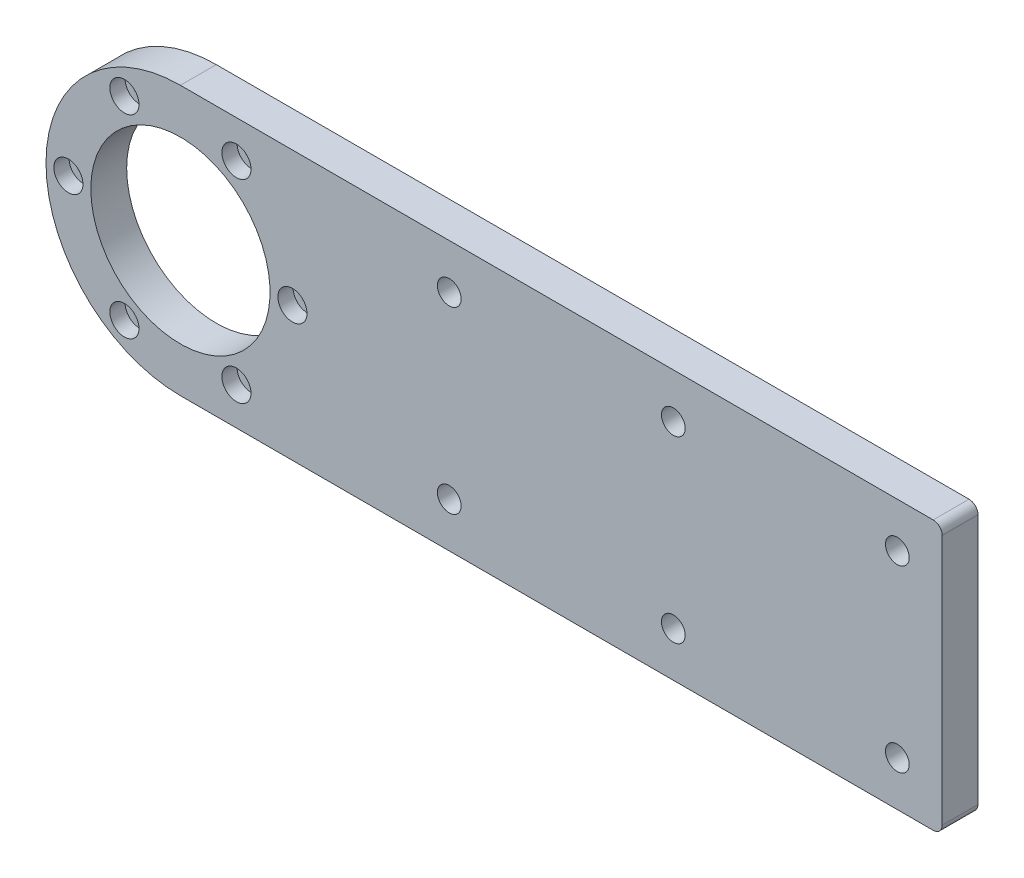
ISO-10303-21;
HEADER;
FILE_DESCRIPTION(('STEP AP214'),'2;1');
FILE_NAME('part.step','',(''),(''),'','','');
FILE_SCHEMA(('AUTOMOTIVE_DESIGN { 1 0 10303 214 1 1 1 1 }'));
ENDSEC;
DATA;
#1=APPLICATION_CONTEXT('core data for automotive mechanical design processes');
#2=APPLICATION_PROTOCOL_DEFINITION('international standard','automotive_design',2000,#1);
#3=PRODUCT_CONTEXT('',#1,'mechanical');
#4=PRODUCT('Part','Part','',(#3));
#5=PRODUCT_RELATED_PRODUCT_CATEGORY('part','',(#4));
#6=PRODUCT_DEFINITION_FORMATION('','',#4);
#7=PRODUCT_DEFINITION_CONTEXT('part definition',#1,'design');
#8=PRODUCT_DEFINITION('design','',#6,#7);
#9=PRODUCT_DEFINITION_SHAPE('','',#8);
#10=(LENGTH_UNIT() NAMED_UNIT(*) SI_UNIT(.MILLI.,.METRE.));
#11=(NAMED_UNIT(*) PLANE_ANGLE_UNIT() SI_UNIT($,.RADIAN.));
#12=(NAMED_UNIT(*) SI_UNIT($,.STERADIAN.) SOLID_ANGLE_UNIT());
#13=UNCERTAINTY_MEASURE_WITH_UNIT(LENGTH_MEASURE(1.E-05),#10,'distance_accuracy_value','');
#14=(GEOMETRIC_REPRESENTATION_CONTEXT(3) GLOBAL_UNCERTAINTY_ASSIGNED_CONTEXT((#13)) GLOBAL_UNIT_ASSIGNED_CONTEXT((#10,
#11,#12)) REPRESENTATION_CONTEXT('',''));
#15=CARTESIAN_POINT('',(0.,0.,0.));
#16=DIRECTION('',(0.,0.,1.));
#17=DIRECTION('',(1.,0.,0.));
#18=AXIS2_PLACEMENT_3D('',#15,#16,#17);
#19=CARTESIAN_POINT('',(0.,0.,0.));
#20=DIRECTION('',(0.,0.,1.));
#21=DIRECTION('',(-1.,0.,0.));
#22=AXIS2_PLACEMENT_3D('',#19,#20,#21);
#23=CYLINDRICAL_SURFACE('',#22,30.);
#24=CARTESIAN_POINT('',(0.,0.,0.));
#25=DIRECTION('',(0.,0.,1.));
#26=DIRECTION('',(1.,0.,0.));
#27=AXIS2_PLACEMENT_3D('',#24,#25,#26);
#28=CIRCLE('',#27,30.);
#29=CARTESIAN_POINT('',(0.,30.,0.));
#30=VERTEX_POINT('',#29);
#31=CARTESIAN_POINT('',(0.,-30.,0.));
#32=VERTEX_POINT('',#31);
#33=EDGE_CURVE('E316',#30,#32,#28,.T.);
#34=ORIENTED_EDGE('',*,*,#33,.T.);
#35=DIRECTION('',(0.,0.,1.));
#36=VECTOR('',#35,1.);
#37=CARTESIAN_POINT('',(0.,-30.,0.));
#38=LINE('',#37,#36);
#39=CARTESIAN_POINT('',(0.,-30.,8.));
#40=VERTEX_POINT('',#39);
#41=EDGE_CURVE('E276',#32,#40,#38,.T.);
#42=ORIENTED_EDGE('',*,*,#41,.T.);
#43=CARTESIAN_POINT('',(0.,0.,8.));
#44=DIRECTION('',(0.,0.,1.));
#45=DIRECTION('',(1.,0.,0.));
#46=AXIS2_PLACEMENT_3D('',#43,#44,#45);
#47=CIRCLE('',#46,30.);
#48=CARTESIAN_POINT('',(0.,30.,8.));
#49=VERTEX_POINT('',#48);
#50=EDGE_CURVE('E289',#49,#40,#47,.T.);
#51=ORIENTED_EDGE('',*,*,#50,.F.);
#52=DIRECTION('',(0.,0.,1.));
#53=VECTOR('',#52,1.);
#54=CARTESIAN_POINT('',(0.,30.,0.));
#55=LINE('',#54,#53);
#56=EDGE_CURVE('E366',#30,#49,#55,.T.);
#57=ORIENTED_EDGE('',*,*,#56,.F.);
#58=EDGE_LOOP('',(#34,#42,#51,#57));
#59=FACE_BOUND('',#58,.T.);
#60=ADVANCED_FACE('F17',(#59),#23,.T.);
#61=CARTESIAN_POINT('',(0.,0.,8.));
#62=DIRECTION('',(0.,0.,-1.));
#63=DIRECTION('',(1.,0.,0.));
#64=AXIS2_PLACEMENT_3D('',#61,#62,#63);
#65=CYLINDRICAL_SURFACE('',#64,20.);
#66=CARTESIAN_POINT('',(0.,0.,8.));
#67=DIRECTION('',(0.,0.,-1.));
#68=DIRECTION('',(1.,0.,0.));
#69=AXIS2_PLACEMENT_3D('',#66,#67,#68);
#70=CIRCLE('',#69,20.);
#71=CARTESIAN_POINT('',(-20.,0.,8.));
#72=VERTEX_POINT('',#71);
#73=EDGE_CURVE('E356',#72,#72,#70,.T.);
#74=ORIENTED_EDGE('',*,*,#73,.F.);
#75=DIRECTION('',(0.,0.,-1.));
#76=VECTOR('',#75,1.);
#77=CARTESIAN_POINT('',(-20.,0.,8.));
#78=LINE('',#77,#76);
#79=CARTESIAN_POINT('',(-20.,0.,0.));
#80=VERTEX_POINT('',#79);
#81=EDGE_CURVE('E11',#72,#80,#78,.T.);
#82=ORIENTED_EDGE('',*,*,#81,.T.);
#83=CARTESIAN_POINT('',(0.,0.,0.));
#84=DIRECTION('',(0.,0.,1.));
#85=DIRECTION('',(1.,0.,0.));
#86=AXIS2_PLACEMENT_3D('',#83,#84,#85);
#87=CIRCLE('',#86,20.);
#88=EDGE_CURVE('E311',#80,#80,#87,.T.);
#89=ORIENTED_EDGE('',*,*,#88,.F.);
#90=ORIENTED_EDGE('',*,*,#81,.F.);
#91=EDGE_LOOP('',(#74,#82,#89,#90));
#92=FACE_BOUND('',#91,.T.);
#93=ADVANCED_FACE('F549',(#92),#65,.F.);
#94=CARTESIAN_POINT('',(-25.,0.,-436.144120753613));
#95=DIRECTION('',(0.,0.,1.));
#96=DIRECTION('',(1.,0.,0.));
#97=AXIS2_PLACEMENT_3D('',#94,#95,#96);
#98=CYLINDRICAL_SURFACE('',#97,1.6);
#99=CARTESIAN_POINT('',(-25.,0.,4.6));
#100=DIRECTION('',(0.,0.,1.));
#101=DIRECTION('',(1.,0.,0.));
#102=AXIS2_PLACEMENT_3D('',#99,#100,#101);
#103=CIRCLE('',#102,1.6);
#104=CARTESIAN_POINT('',(-26.6,0.,4.6));
#105=VERTEX_POINT('',#104);
#106=EDGE_CURVE('E414',#105,#105,#103,.T.);
#107=ORIENTED_EDGE('',*,*,#106,.T.);
#108=DIRECTION('',(0.,0.,-1.));
#109=VECTOR('',#108,1.);
#110=CARTESIAN_POINT('',(-26.6,0.,-436.144120753613));
#111=LINE('',#110,#109);
#112=CARTESIAN_POINT('',(-26.6,0.,0.));
#113=VERTEX_POINT('',#112);
#114=EDGE_CURVE('E21',#105,#113,#111,.T.);
#115=ORIENTED_EDGE('',*,*,#114,.T.);
#116=CARTESIAN_POINT('',(-25.,0.,0.));
#117=DIRECTION('',(0.,0.,1.));
#118=DIRECTION('',(1.,0.,0.));
#119=AXIS2_PLACEMENT_3D('',#116,#117,#118);
#120=CIRCLE('',#119,1.6);
#121=EDGE_CURVE('E315',#113,#113,#120,.T.);
#122=ORIENTED_EDGE('',*,*,#121,.F.);
#123=ORIENTED_EDGE('',*,*,#114,.F.);
#124=EDGE_LOOP('',(#107,#115,#122,#123));
#125=FACE_BOUND('',#124,.T.);
#126=ADVANCED_FACE('F19',(#125),#98,.F.);
#127=CARTESIAN_POINT('',(-25.,0.,6.3));
#128=DIRECTION('',(0.,0.,1.));
#129=DIRECTION('',(1.,0.,0.));
#130=AXIS2_PLACEMENT_3D('',#127,#128,#129);
#131=CYLINDRICAL_SURFACE('',#130,3.25);
#132=CARTESIAN_POINT('',(-25.,0.,8.));
#133=DIRECTION('',(0.,0.,-1.));
#134=DIRECTION('',(1.,0.,0.));
#135=AXIS2_PLACEMENT_3D('',#132,#133,#134);
#136=CIRCLE('',#135,3.25);
#137=CARTESIAN_POINT('',(-28.25,0.,8.));
#138=VERTEX_POINT('',#137);
#139=EDGE_CURVE('E349',#138,#138,#136,.T.);
#140=ORIENTED_EDGE('',*,*,#139,.F.);
#141=DIRECTION('',(0.,0.,-1.));
#142=VECTOR('',#141,1.);
#143=CARTESIAN_POINT('',(-28.25,0.,6.3));
#144=LINE('',#143,#142);
#145=CARTESIAN_POINT('',(-28.25,0.,4.6));
#146=VERTEX_POINT('',#145);
#147=EDGE_CURVE('E47',#138,#146,#144,.T.);
#148=ORIENTED_EDGE('',*,*,#147,.T.);
#149=CARTESIAN_POINT('',(-25.,0.,4.6));
#150=DIRECTION('',(0.,0.,1.));
#151=DIRECTION('',(1.,0.,0.));
#152=AXIS2_PLACEMENT_3D('',#149,#150,#151);
#153=CIRCLE('',#152,3.25);
#154=EDGE_CURVE('E370',#146,#146,#153,.T.);
#155=ORIENTED_EDGE('',*,*,#154,.F.);
#156=ORIENTED_EDGE('',*,*,#147,.F.);
#157=EDGE_LOOP('',(#140,#148,#155,#156));
#158=FACE_BOUND('',#157,.T.);
#159=ADVANCED_FACE('F565',(#158),#131,.F.);
#160=CARTESIAN_POINT('',(-25.,0.,4.6));
#161=DIRECTION('',(0.,0.,1.));
#162=DIRECTION('',(1.,0.,0.));
#163=AXIS2_PLACEMENT_3D('',#160,#161,#162);
#164=PLANE('',#163);
#165=ORIENTED_EDGE('',*,*,#106,.F.);
#166=EDGE_LOOP('',(#165));
#167=FACE_BOUND('',#166,.T.);
#168=ORIENTED_EDGE('',*,*,#154,.T.);
#169=EDGE_LOOP('',(#168));
#170=FACE_BOUND('',#169,.T.);
#171=ADVANCED_FACE('F561',(#167,#170),#164,.T.);
#172=CARTESIAN_POINT('',(-12.5,-21.650635094611,-436.144120753613));
#173=DIRECTION('',(0.,0.,1.));
#174=DIRECTION('',(1.,0.,0.));
#175=AXIS2_PLACEMENT_3D('',#172,#173,#174);
#176=CYLINDRICAL_SURFACE('',#175,1.6);
#177=CARTESIAN_POINT('',(-12.5,-21.650635094611,4.6));
#178=DIRECTION('',(0.,0.,1.));
#179=DIRECTION('',(1.,0.,0.));
#180=AXIS2_PLACEMENT_3D('',#177,#178,#179);
#181=CIRCLE('',#180,1.6);
#182=CARTESIAN_POINT('',(-14.1,-21.650635094611,4.6));
#183=VERTEX_POINT('',#182);
#184=EDGE_CURVE('E305',#183,#183,#181,.T.);
#185=ORIENTED_EDGE('',*,*,#184,.T.);
#186=DIRECTION('',(0.,0.,-1.));
#187=VECTOR('',#186,1.);
#188=CARTESIAN_POINT('',(-14.1,-21.650635094611,-436.144120753613));
#189=LINE('',#188,#187);
#190=CARTESIAN_POINT('',(-14.1,-21.650635094611,0.));
#191=VERTEX_POINT('',#190);
#192=EDGE_CURVE('E367',#183,#191,#189,.T.);
#193=ORIENTED_EDGE('',*,*,#192,.T.);
#194=CARTESIAN_POINT('',(-12.5,-21.650635094611,0.));
#195=DIRECTION('',(0.,0.,1.));
#196=DIRECTION('',(1.,0.,0.));
#197=AXIS2_PLACEMENT_3D('',#194,#195,#196);
#198=CIRCLE('',#197,1.6);
#199=EDGE_CURVE('E381',#191,#191,#198,.T.);
#200=ORIENTED_EDGE('',*,*,#199,.F.);
#201=ORIENTED_EDGE('',*,*,#192,.F.);
#202=EDGE_LOOP('',(#185,#193,#200,#201));
#203=FACE_BOUND('',#202,.T.);
#204=ADVANCED_FACE('F564',(#203),#176,.F.);
#205=CARTESIAN_POINT('',(-12.5,-21.650635094611,6.3));
#206=DIRECTION('',(0.,0.,1.));
#207=DIRECTION('',(1.,0.,0.));
#208=AXIS2_PLACEMENT_3D('',#205,#206,#207);
#209=CYLINDRICAL_SURFACE('',#208,3.25);
#210=CARTESIAN_POINT('',(-12.5,-21.650635094611,8.));
#211=DIRECTION('',(0.,0.,-1.));
#212=DIRECTION('',(1.,0.,0.));
#213=AXIS2_PLACEMENT_3D('',#210,#211,#212);
#214=CIRCLE('',#213,3.25);
#215=CARTESIAN_POINT('',(-15.75,-21.650635094611,8.));
#216=VERTEX_POINT('',#215);
#217=EDGE_CURVE('E345',#216,#216,#214,.T.);
#218=ORIENTED_EDGE('',*,*,#217,.F.);
#219=DIRECTION('',(0.,0.,-1.));
#220=VECTOR('',#219,1.);
#221=CARTESIAN_POINT('',(-15.75,-21.650635094611,6.3));
#222=LINE('',#221,#220);
#223=CARTESIAN_POINT('',(-15.75,-21.650635094611,4.6));
#224=VERTEX_POINT('',#223);
#225=EDGE_CURVE('E309',#216,#224,#222,.T.);
#226=ORIENTED_EDGE('',*,*,#225,.T.);
#227=CARTESIAN_POINT('',(-12.5,-21.650635094611,4.6));
#228=DIRECTION('',(0.,0.,1.));
#229=DIRECTION('',(1.,0.,0.));
#230=AXIS2_PLACEMENT_3D('',#227,#228,#229);
#231=CIRCLE('',#230,3.25);
#232=EDGE_CURVE('E310',#224,#224,#231,.T.);
#233=ORIENTED_EDGE('',*,*,#232,.F.);
#234=ORIENTED_EDGE('',*,*,#225,.F.);
#235=EDGE_LOOP('',(#218,#226,#233,#234));
#236=FACE_BOUND('',#235,.T.);
#237=ADVANCED_FACE('F570',(#236),#209,.F.);
#238=CARTESIAN_POINT('',(-12.5,-21.650635094611,4.6));
#239=DIRECTION('',(0.,0.,1.));
#240=DIRECTION('',(1.,0.,0.));
#241=AXIS2_PLACEMENT_3D('',#238,#239,#240);
#242=PLANE('',#241);
#243=ORIENTED_EDGE('',*,*,#184,.F.);
#244=EDGE_LOOP('',(#243));
#245=FACE_BOUND('',#244,.T.);
#246=ORIENTED_EDGE('',*,*,#232,.T.);
#247=EDGE_LOOP('',(#246));
#248=FACE_BOUND('',#247,.T.);
#249=ADVANCED_FACE('F567',(#245,#248),#242,.T.);
#250=CARTESIAN_POINT('',(12.5,-21.650635094611,-436.144120753613));
#251=DIRECTION('',(0.,0.,1.));
#252=DIRECTION('',(1.,0.,0.));
#253=AXIS2_PLACEMENT_3D('',#250,#251,#252);
#254=CYLINDRICAL_SURFACE('',#253,1.6);
#255=CARTESIAN_POINT('',(12.5,-21.650635094611,4.6));
#256=DIRECTION('',(0.,0.,1.));
#257=DIRECTION('',(1.,0.,0.));
#258=AXIS2_PLACEMENT_3D('',#255,#256,#257);
#259=CIRCLE('',#258,1.6);
#260=CARTESIAN_POINT('',(10.9,-21.650635094611,4.6));
#261=VERTEX_POINT('',#260);
#262=EDGE_CURVE('E327',#261,#261,#259,.T.);
#263=ORIENTED_EDGE('',*,*,#262,.T.);
#264=DIRECTION('',(0.,0.,-1.));
#265=VECTOR('',#264,1.);
#266=CARTESIAN_POINT('',(10.9,-21.650635094611,-436.144120753613));
#267=LINE('',#266,#265);
#268=CARTESIAN_POINT('',(10.9,-21.650635094611,0.));
#269=VERTEX_POINT('',#268);
#270=EDGE_CURVE('E340',#261,#269,#267,.T.);
#271=ORIENTED_EDGE('',*,*,#270,.T.);
#272=CARTESIAN_POINT('',(12.5,-21.650635094611,0.));
#273=DIRECTION('',(0.,0.,1.));
#274=DIRECTION('',(1.,0.,0.));
#275=AXIS2_PLACEMENT_3D('',#272,#273,#274);
#276=CIRCLE('',#275,1.6);
#277=EDGE_CURVE('E391',#269,#269,#276,.T.);
#278=ORIENTED_EDGE('',*,*,#277,.F.);
#279=ORIENTED_EDGE('',*,*,#270,.F.);
#280=EDGE_LOOP('',(#263,#271,#278,#279));
#281=FACE_BOUND('',#280,.T.);
#282=ADVANCED_FACE('F559',(#281),#254,.F.);
#283=CARTESIAN_POINT('',(12.5,-21.650635094611,6.3));
#284=DIRECTION('',(0.,0.,1.));
#285=DIRECTION('',(1.,0.,0.));
#286=AXIS2_PLACEMENT_3D('',#283,#284,#285);
#287=CYLINDRICAL_SURFACE('',#286,3.25);
#288=CARTESIAN_POINT('',(12.5,-21.650635094611,8.));
#289=DIRECTION('',(0.,0.,-1.));
#290=DIRECTION('',(1.,0.,0.));
#291=AXIS2_PLACEMENT_3D('',#288,#289,#290);
#292=CIRCLE('',#291,3.25);
#293=CARTESIAN_POINT('',(9.25,-21.650635094611,8.));
#294=VERTEX_POINT('',#293);
#295=EDGE_CURVE('E344',#294,#294,#292,.T.);
#296=ORIENTED_EDGE('',*,*,#295,.F.);
#297=DIRECTION('',(0.,0.,-1.));
#298=VECTOR('',#297,1.);
#299=CARTESIAN_POINT('',(9.25,-21.650635094611,6.3));
#300=LINE('',#299,#298);
#301=CARTESIAN_POINT('',(9.25,-21.650635094611,4.6));
#302=VERTEX_POINT('',#301);
#303=EDGE_CURVE('E337',#294,#302,#300,.T.);
#304=ORIENTED_EDGE('',*,*,#303,.T.);
#305=CARTESIAN_POINT('',(12.5,-21.650635094611,4.6));
#306=DIRECTION('',(0.,0.,1.));
#307=DIRECTION('',(1.,0.,0.));
#308=AXIS2_PLACEMENT_3D('',#305,#306,#307);
#309=CIRCLE('',#308,3.25);
#310=EDGE_CURVE('E323',#302,#302,#309,.T.);
#311=ORIENTED_EDGE('',*,*,#310,.F.);
#312=ORIENTED_EDGE('',*,*,#303,.F.);
#313=EDGE_LOOP('',(#296,#304,#311,#312));
#314=FACE_BOUND('',#313,.T.);
#315=ADVANCED_FACE('F1066',(#314),#287,.F.);
#316=CARTESIAN_POINT('',(12.5,-21.650635094611,4.6));
#317=DIRECTION('',(0.,0.,1.));
#318=DIRECTION('',(1.,0.,0.));
#319=AXIS2_PLACEMENT_3D('',#316,#317,#318);
#320=PLANE('',#319);
#321=ORIENTED_EDGE('',*,*,#262,.F.);
#322=EDGE_LOOP('',(#321));
#323=FACE_BOUND('',#322,.T.);
#324=ORIENTED_EDGE('',*,*,#310,.T.);
#325=EDGE_LOOP('',(#324));
#326=FACE_BOUND('',#325,.T.);
#327=ADVANCED_FACE('F1056',(#323,#326),#320,.T.);
#328=CARTESIAN_POINT('',(25.,0.,-436.144120753613));
#329=DIRECTION('',(0.,0.,1.));
#330=DIRECTION('',(1.,0.,0.));
#331=AXIS2_PLACEMENT_3D('',#328,#329,#330);
#332=CYLINDRICAL_SURFACE('',#331,1.6);
#333=CARTESIAN_POINT('',(25.,0.,4.6));
#334=DIRECTION('',(0.,0.,1.));
#335=DIRECTION('',(1.,0.,0.));
#336=AXIS2_PLACEMENT_3D('',#333,#334,#335);
#337=CIRCLE('',#336,1.6);
#338=CARTESIAN_POINT('',(23.4,0.,4.6));
#339=VERTEX_POINT('',#338);
#340=EDGE_CURVE('E464',#339,#339,#337,.T.);
#341=ORIENTED_EDGE('',*,*,#340,.T.);
#342=DIRECTION('',(0.,0.,-1.));
#343=VECTOR('',#342,1.);
#344=CARTESIAN_POINT('',(23.4,0.,-436.144120753613));
#345=LINE('',#344,#343);
#346=CARTESIAN_POINT('',(23.4,0.,0.));
#347=VERTEX_POINT('',#346);
#348=EDGE_CURVE('E328',#339,#347,#345,.T.);
#349=ORIENTED_EDGE('',*,*,#348,.T.);
#350=CARTESIAN_POINT('',(25.,0.,0.));
#351=DIRECTION('',(0.,0.,1.));
#352=DIRECTION('',(1.,0.,0.));
#353=AXIS2_PLACEMENT_3D('',#350,#351,#352);
#354=CIRCLE('',#353,1.6);
#355=EDGE_CURVE('E411',#347,#347,#354,.T.);
#356=ORIENTED_EDGE('',*,*,#355,.F.);
#357=ORIENTED_EDGE('',*,*,#348,.F.);
#358=EDGE_LOOP('',(#341,#349,#356,#357));
#359=FACE_BOUND('',#358,.T.);
#360=ADVANCED_FACE('F1046',(#359),#332,.F.);
#361=CARTESIAN_POINT('',(25.,0.,6.3));
#362=DIRECTION('',(0.,0.,1.));
#363=DIRECTION('',(1.,0.,0.));
#364=AXIS2_PLACEMENT_3D('',#361,#362,#363);
#365=CYLINDRICAL_SURFACE('',#364,3.25);
#366=CARTESIAN_POINT('',(25.,0.,8.));
#367=DIRECTION('',(0.,0.,-1.));
#368=DIRECTION('',(1.,0.,0.));
#369=AXIS2_PLACEMENT_3D('',#366,#367,#368);
#370=CIRCLE('',#369,3.25);
#371=CARTESIAN_POINT('',(21.75,0.,8.));
#372=VERTEX_POINT('',#371);
#373=EDGE_CURVE('E336',#372,#372,#370,.T.);
#374=ORIENTED_EDGE('',*,*,#373,.F.);
#375=DIRECTION('',(0.,0.,-1.));
#376=VECTOR('',#375,1.);
#377=CARTESIAN_POINT('',(21.75,0.,6.3));
#378=LINE('',#377,#376);
#379=CARTESIAN_POINT('',(21.75,0.,4.6));
#380=VERTEX_POINT('',#379);
#381=EDGE_CURVE('E468',#372,#380,#378,.T.);
#382=ORIENTED_EDGE('',*,*,#381,.T.);
#383=CARTESIAN_POINT('',(25.,0.,4.6));
#384=DIRECTION('',(0.,0.,1.));
#385=DIRECTION('',(1.,0.,0.));
#386=AXIS2_PLACEMENT_3D('',#383,#384,#385);
#387=CIRCLE('',#386,3.25);
#388=EDGE_CURVE('E460',#380,#380,#387,.T.);
#389=ORIENTED_EDGE('',*,*,#388,.F.);
#390=ORIENTED_EDGE('',*,*,#381,.F.);
#391=EDGE_LOOP('',(#374,#382,#389,#390));
#392=FACE_BOUND('',#391,.T.);
#393=ADVANCED_FACE('F1036',(#392),#365,.F.);
#394=CARTESIAN_POINT('',(25.,0.,4.6));
#395=DIRECTION('',(0.,0.,1.));
#396=DIRECTION('',(1.,0.,0.));
#397=AXIS2_PLACEMENT_3D('',#394,#395,#396);
#398=PLANE('',#397);
#399=ORIENTED_EDGE('',*,*,#340,.F.);
#400=EDGE_LOOP('',(#399));
#401=FACE_BOUND('',#400,.T.);
#402=ORIENTED_EDGE('',*,*,#388,.T.);
#403=EDGE_LOOP('',(#402));
#404=FACE_BOUND('',#403,.T.);
#405=ADVANCED_FACE('F1026',(#401,#404),#398,.T.);
#406=CARTESIAN_POINT('',(12.5,21.650635094611,-436.144120753613));
#407=DIRECTION('',(0.,0.,1.));
#408=DIRECTION('',(1.,0.,0.));
#409=AXIS2_PLACEMENT_3D('',#406,#407,#408);
#410=CYLINDRICAL_SURFACE('',#409,1.6);
#411=CARTESIAN_POINT('',(12.5,21.650635094611,4.6));
#412=DIRECTION('',(0.,0.,1.));
#413=DIRECTION('',(1.,0.,0.));
#414=AXIS2_PLACEMENT_3D('',#411,#412,#413);
#415=CIRCLE('',#414,1.6);
#416=CARTESIAN_POINT('',(10.9,21.650635094611,4.6));
#417=VERTEX_POINT('',#416);
#418=EDGE_CURVE('E396',#417,#417,#415,.T.);
#419=ORIENTED_EDGE('',*,*,#418,.T.);
#420=DIRECTION('',(0.,0.,-1.));
#421=VECTOR('',#420,1.);
#422=CARTESIAN_POINT('',(10.9,21.650635094611,-436.144120753613));
#423=LINE('',#422,#421);
#424=CARTESIAN_POINT('',(10.9,21.650635094611,0.));
#425=VERTEX_POINT('',#424);
#426=EDGE_CURVE('E435',#417,#425,#423,.T.);
#427=ORIENTED_EDGE('',*,*,#426,.T.);
#428=CARTESIAN_POINT('',(12.5,21.650635094611,0.));
#429=DIRECTION('',(0.,0.,1.));
#430=DIRECTION('',(1.,0.,0.));
#431=AXIS2_PLACEMENT_3D('',#428,#429,#430);
#432=CIRCLE('',#431,1.6);
#433=EDGE_CURVE('E418',#425,#425,#432,.T.);
#434=ORIENTED_EDGE('',*,*,#433,.F.);
#435=ORIENTED_EDGE('',*,*,#426,.F.);
#436=EDGE_LOOP('',(#419,#427,#434,#435));
#437=FACE_BOUND('',#436,.T.);
#438=ADVANCED_FACE('F1016',(#437),#410,.F.);
#439=CARTESIAN_POINT('',(12.5,21.650635094611,6.3));
#440=DIRECTION('',(0.,0.,1.));
#441=DIRECTION('',(1.,0.,0.));
#442=AXIS2_PLACEMENT_3D('',#439,#440,#441);
#443=CYLINDRICAL_SURFACE('',#442,3.25);
#444=CARTESIAN_POINT('',(12.5,21.650635094611,8.));
#445=DIRECTION('',(0.,0.,-1.));
#446=DIRECTION('',(1.,0.,0.));
#447=AXIS2_PLACEMENT_3D('',#444,#445,#446);
#448=CIRCLE('',#447,3.25);
#449=CARTESIAN_POINT('',(9.25,21.650635094611,8.));
#450=VERTEX_POINT('',#449);
#451=EDGE_CURVE('E332',#450,#450,#448,.T.);
#452=ORIENTED_EDGE('',*,*,#451,.F.);
#453=DIRECTION('',(0.,0.,-1.));
#454=VECTOR('',#453,1.);
#455=CARTESIAN_POINT('',(9.25,21.650635094611,6.3));
#456=LINE('',#455,#454);
#457=CARTESIAN_POINT('',(9.25,21.650635094611,4.6));
#458=VERTEX_POINT('',#457);
#459=EDGE_CURVE('E432',#450,#458,#456,.T.);
#460=ORIENTED_EDGE('',*,*,#459,.T.);
#461=CARTESIAN_POINT('',(12.5,21.650635094611,4.6));
#462=DIRECTION('',(0.,0.,1.));
#463=DIRECTION('',(1.,0.,0.));
#464=AXIS2_PLACEMENT_3D('',#461,#462,#463);
#465=CIRCLE('',#464,3.25);
#466=EDGE_CURVE('E392',#458,#458,#465,.T.);
#467=ORIENTED_EDGE('',*,*,#466,.F.);
#468=ORIENTED_EDGE('',*,*,#459,.F.);
#469=EDGE_LOOP('',(#452,#460,#467,#468));
#470=FACE_BOUND('',#469,.T.);
#471=ADVANCED_FACE('F1006',(#470),#443,.F.);
#472=CARTESIAN_POINT('',(12.5,21.650635094611,4.6));
#473=DIRECTION('',(0.,0.,1.));
#474=DIRECTION('',(1.,0.,0.));
#475=AXIS2_PLACEMENT_3D('',#472,#473,#474);
#476=PLANE('',#475);
#477=ORIENTED_EDGE('',*,*,#418,.F.);
#478=EDGE_LOOP('',(#477));
#479=FACE_BOUND('',#478,.T.);
#480=ORIENTED_EDGE('',*,*,#466,.T.);
#481=EDGE_LOOP('',(#480));
#482=FACE_BOUND('',#481,.T.);
#483=ADVANCED_FACE('F997',(#479,#482),#476,.T.);
#484=CARTESIAN_POINT('',(-12.5,21.650635094611,-436.144120753613));
#485=DIRECTION('',(0.,0.,1.));
#486=DIRECTION('',(1.,0.,0.));
#487=AXIS2_PLACEMENT_3D('',#484,#485,#486);
#488=CYLINDRICAL_SURFACE('',#487,1.6);
#489=CARTESIAN_POINT('',(-12.5,21.650635094611,4.6));
#490=DIRECTION('',(0.,0.,1.));
#491=DIRECTION('',(1.,0.,0.));
#492=AXIS2_PLACEMENT_3D('',#489,#490,#491);
#493=CIRCLE('',#492,1.6);
#494=CARTESIAN_POINT('',(-14.1,21.650635094611,4.6));
#495=VERTEX_POINT('',#494);
#496=EDGE_CURVE('E286',#495,#495,#493,.T.);
#497=ORIENTED_EDGE('',*,*,#496,.T.);
#498=DIRECTION('',(0.,0.,-1.));
#499=VECTOR('',#498,1.);
#500=CARTESIAN_POINT('',(-14.1,21.650635094611,-436.144120753613));
#501=LINE('',#500,#499);
#502=CARTESIAN_POINT('',(-14.1,21.650635094611,0.));
#503=VERTEX_POINT('',#502);
#504=EDGE_CURVE('E285',#495,#503,#501,.T.);
#505=ORIENTED_EDGE('',*,*,#504,.T.);
#506=CARTESIAN_POINT('',(-12.5,21.650635094611,0.));
#507=DIRECTION('',(0.,0.,1.));
#508=DIRECTION('',(1.,0.,0.));
#509=AXIS2_PLACEMENT_3D('',#506,#507,#508);
#510=CIRCLE('',#509,1.6);
#511=EDGE_CURVE('E419',#503,#503,#510,.T.);
#512=ORIENTED_EDGE('',*,*,#511,.F.);
#513=ORIENTED_EDGE('',*,*,#504,.F.);
#514=EDGE_LOOP('',(#497,#505,#512,#513));
#515=FACE_BOUND('',#514,.T.);
#516=ADVANCED_FACE('F987',(#515),#488,.F.);
#517=CARTESIAN_POINT('',(-12.5,21.650635094611,6.3));
#518=DIRECTION('',(0.,0.,1.));
#519=DIRECTION('',(1.,0.,0.));
#520=AXIS2_PLACEMENT_3D('',#517,#518,#519);
#521=CYLINDRICAL_SURFACE('',#520,3.25);
#522=CARTESIAN_POINT('',(-12.5,21.650635094611,8.));
#523=DIRECTION('',(0.,0.,-1.));
#524=DIRECTION('',(1.,0.,0.));
#525=AXIS2_PLACEMENT_3D('',#522,#523,#524);
#526=CIRCLE('',#525,3.25);
#527=CARTESIAN_POINT('',(-15.75,21.650635094611,8.));
#528=VERTEX_POINT('',#527);
#529=EDGE_CURVE('E321',#528,#528,#526,.T.);
#530=ORIENTED_EDGE('',*,*,#529,.F.);
#531=DIRECTION('',(0.,0.,-1.));
#532=VECTOR('',#531,1.);
#533=CARTESIAN_POINT('',(-15.75,21.650635094611,6.3));
#534=LINE('',#533,#532);
#535=CARTESIAN_POINT('',(-15.75,21.650635094611,4.6));
#536=VERTEX_POINT('',#535);
#537=EDGE_CURVE('E282',#528,#536,#534,.T.);
#538=ORIENTED_EDGE('',*,*,#537,.T.);
#539=CARTESIAN_POINT('',(-12.5,21.650635094611,4.6));
#540=DIRECTION('',(0.,0.,1.));
#541=DIRECTION('',(1.,0.,0.));
#542=AXIS2_PLACEMENT_3D('',#539,#540,#541);
#543=CIRCLE('',#542,3.25);
#544=EDGE_CURVE('E451',#536,#536,#543,.T.);
#545=ORIENTED_EDGE('',*,*,#544,.F.);
#546=ORIENTED_EDGE('',*,*,#537,.F.);
#547=EDGE_LOOP('',(#530,#538,#545,#546));
#548=FACE_BOUND('',#547,.T.);
#549=ADVANCED_FACE('F979',(#548),#521,.F.);
#550=CARTESIAN_POINT('',(-12.5,21.650635094611,4.6));
#551=DIRECTION('',(0.,0.,1.));
#552=DIRECTION('',(1.,0.,0.));
#553=AXIS2_PLACEMENT_3D('',#550,#551,#552);
#554=PLANE('',#553);
#555=ORIENTED_EDGE('',*,*,#496,.F.);
#556=EDGE_LOOP('',(#555));
#557=FACE_BOUND('',#556,.T.);
#558=ORIENTED_EDGE('',*,*,#544,.T.);
#559=EDGE_LOOP('',(#558));
#560=FACE_BOUND('',#559,.T.);
#561=ADVANCED_FACE('F969',(#557,#560),#554,.T.);
#562=CARTESIAN_POINT('',(60.,20.,444.144120753613));
#563=DIRECTION('',(0.,0.,1.));
#564=DIRECTION('',(1.,0.,0.));
#565=AXIS2_PLACEMENT_3D('',#562,#563,#564);
#566=CYLINDRICAL_SURFACE('',#565,2.65);
#567=CARTESIAN_POINT('',(60.,20.,0.));
#568=DIRECTION('',(0.,0.,1.));
#569=DIRECTION('',(1.,0.,0.));
#570=AXIS2_PLACEMENT_3D('',#567,#568,#569);
#571=CIRCLE('',#570,2.65);
#572=CARTESIAN_POINT('',(57.35,20.,0.));
#573=VERTEX_POINT('',#572);
#574=EDGE_CURVE('E387',#573,#573,#571,.T.);
#575=ORIENTED_EDGE('',*,*,#574,.F.);
#576=DIRECTION('',(0.,0.,1.));
#577=VECTOR('',#576,1.);
#578=CARTESIAN_POINT('',(57.35,20.,444.144120753613));
#579=LINE('',#578,#577);
#580=CARTESIAN_POINT('',(57.35,20.,8.));
#581=VERTEX_POINT('',#580);
#582=EDGE_CURVE('E448',#573,#581,#579,.T.);
#583=ORIENTED_EDGE('',*,*,#582,.T.);
#584=CARTESIAN_POINT('',(60.,20.,8.));
#585=DIRECTION('',(0.,0.,-1.));
#586=DIRECTION('',(1.,0.,0.));
#587=AXIS2_PLACEMENT_3D('',#584,#585,#586);
#588=CIRCLE('',#587,2.65);
#589=EDGE_CURVE('E317',#581,#581,#588,.T.);
#590=ORIENTED_EDGE('',*,*,#589,.F.);
#591=ORIENTED_EDGE('',*,*,#582,.F.);
#592=EDGE_LOOP('',(#575,#583,#590,#591));
#593=FACE_BOUND('',#592,.T.);
#594=ADVANCED_FACE('F959',(#593),#566,.F.);
#595=CARTESIAN_POINT('',(110.,20.,444.144120753613));
#596=DIRECTION('',(0.,0.,1.));
#597=DIRECTION('',(1.,0.,0.));
#598=AXIS2_PLACEMENT_3D('',#595,#596,#597);
#599=CYLINDRICAL_SURFACE('',#598,2.65);
#600=CARTESIAN_POINT('',(110.,20.,0.));
#601=DIRECTION('',(0.,0.,1.));
#602=DIRECTION('',(1.,0.,0.));
#603=AXIS2_PLACEMENT_3D('',#600,#601,#602);
#604=CIRCLE('',#603,2.65);
#605=CARTESIAN_POINT('',(107.35,20.,0.));
#606=VERTEX_POINT('',#605);
#607=EDGE_CURVE('E382',#606,#606,#604,.T.);
#608=ORIENTED_EDGE('',*,*,#607,.F.);
#609=DIRECTION('',(0.,0.,1.));
#610=VECTOR('',#609,1.);
#611=CARTESIAN_POINT('',(107.35,20.,444.144120753613));
#612=LINE('',#611,#610);
#613=CARTESIAN_POINT('',(107.35,20.,8.));
#614=VERTEX_POINT('',#613);
#615=EDGE_CURVE('E400',#606,#614,#612,.T.);
#616=ORIENTED_EDGE('',*,*,#615,.T.);
#617=CARTESIAN_POINT('',(110.,20.,8.));
#618=DIRECTION('',(0.,0.,-1.));
#619=DIRECTION('',(1.,0.,0.));
#620=AXIS2_PLACEMENT_3D('',#617,#618,#619);
#621=CIRCLE('',#620,2.65);
#622=EDGE_CURVE('E322',#614,#614,#621,.T.);
#623=ORIENTED_EDGE('',*,*,#622,.F.);
#624=ORIENTED_EDGE('',*,*,#615,.F.);
#625=EDGE_LOOP('',(#608,#616,#623,#624));
#626=FACE_BOUND('',#625,.T.);
#627=ADVANCED_FACE('F949',(#626),#599,.F.);
#628=CARTESIAN_POINT('',(160.,20.,444.144120753613));
#629=DIRECTION('',(0.,0.,1.));
#630=DIRECTION('',(1.,0.,0.));
#631=AXIS2_PLACEMENT_3D('',#628,#629,#630);
#632=CYLINDRICAL_SURFACE('',#631,2.65);
#633=CARTESIAN_POINT('',(160.,20.,0.));
#634=DIRECTION('',(0.,0.,1.));
#635=DIRECTION('',(1.,0.,0.));
#636=AXIS2_PLACEMENT_3D('',#633,#634,#635);
#637=CIRCLE('',#636,2.65);
#638=CARTESIAN_POINT('',(157.35,20.,0.));
#639=VERTEX_POINT('',#638);
#640=EDGE_CURVE('E386',#639,#639,#637,.T.);
#641=ORIENTED_EDGE('',*,*,#640,.F.);
#642=DIRECTION('',(0.,0.,1.));
#643=VECTOR('',#642,1.);
#644=CARTESIAN_POINT('',(157.35,20.,444.144120753613));
#645=LINE('',#644,#643);
#646=CARTESIAN_POINT('',(157.35,20.,8.));
#647=VERTEX_POINT('',#646);
#648=EDGE_CURVE('E397',#639,#647,#645,.T.);
#649=ORIENTED_EDGE('',*,*,#648,.T.);
#650=CARTESIAN_POINT('',(160.,20.,8.));
#651=DIRECTION('',(0.,0.,-1.));
#652=DIRECTION('',(1.,0.,0.));
#653=AXIS2_PLACEMENT_3D('',#650,#651,#652);
#654=CIRCLE('',#653,2.65);
#655=EDGE_CURVE('E304',#647,#647,#654,.T.);
#656=ORIENTED_EDGE('',*,*,#655,.F.);
#657=ORIENTED_EDGE('',*,*,#648,.F.);
#658=EDGE_LOOP('',(#641,#649,#656,#657));
#659=FACE_BOUND('',#658,.T.);
#660=ADVANCED_FACE('F939',(#659),#632,.F.);
#661=CARTESIAN_POINT('',(60.,-20.,444.144120753613));
#662=DIRECTION('',(0.,0.,1.));
#663=DIRECTION('',(1.,0.,0.));
#664=AXIS2_PLACEMENT_3D('',#661,#662,#663);
#665=CYLINDRICAL_SURFACE('',#664,2.65);
#666=CARTESIAN_POINT('',(60.,-20.,0.));
#667=DIRECTION('',(0.,0.,1.));
#668=DIRECTION('',(1.,0.,0.));
#669=AXIS2_PLACEMENT_3D('',#666,#667,#668);
#670=CIRCLE('',#669,2.65);
#671=CARTESIAN_POINT('',(57.35,-20.,0.));
#672=VERTEX_POINT('',#671);
#673=EDGE_CURVE('E279',#672,#672,#670,.T.);
#674=ORIENTED_EDGE('',*,*,#673,.F.);
#675=DIRECTION('',(0.,0.,1.));
#676=VECTOR('',#675,1.);
#677=CARTESIAN_POINT('',(57.35,-20.,444.144120753613));
#678=LINE('',#677,#676);
#679=CARTESIAN_POINT('',(57.35,-20.,8.));
#680=VERTEX_POINT('',#679);
#681=EDGE_CURVE('E401',#672,#680,#678,.T.);
#682=ORIENTED_EDGE('',*,*,#681,.T.);
#683=CARTESIAN_POINT('',(60.,-20.,8.));
#684=DIRECTION('',(0.,0.,-1.));
#685=DIRECTION('',(1.,0.,0.));
#686=AXIS2_PLACEMENT_3D('',#683,#684,#685);
#687=CIRCLE('',#686,2.65);
#688=EDGE_CURVE('E300',#680,#680,#687,.T.);
#689=ORIENTED_EDGE('',*,*,#688,.F.);
#690=ORIENTED_EDGE('',*,*,#681,.F.);
#691=EDGE_LOOP('',(#674,#682,#689,#690));
#692=FACE_BOUND('',#691,.T.);
#693=ADVANCED_FACE('F928',(#692),#665,.F.);
#694=CARTESIAN_POINT('',(110.,-20.,444.144120753613));
#695=DIRECTION('',(0.,0.,1.));
#696=DIRECTION('',(1.,0.,0.));
#697=AXIS2_PLACEMENT_3D('',#694,#695,#696);
#698=CYLINDRICAL_SURFACE('',#697,2.65);
#699=CARTESIAN_POINT('',(110.,-20.,0.));
#700=DIRECTION('',(0.,0.,1.));
#701=DIRECTION('',(1.,0.,0.));
#702=AXIS2_PLACEMENT_3D('',#699,#700,#701);
#703=CIRCLE('',#702,2.65);
#704=CARTESIAN_POINT('',(107.35,-20.,0.));
#705=VERTEX_POINT('',#704);
#706=EDGE_CURVE('E407',#705,#705,#703,.T.);
#707=ORIENTED_EDGE('',*,*,#706,.F.);
#708=DIRECTION('',(0.,0.,1.));
#709=VECTOR('',#708,1.);
#710=CARTESIAN_POINT('',(107.35,-20.,444.144120753613));
#711=LINE('',#710,#709);
#712=CARTESIAN_POINT('',(107.35,-20.,8.));
#713=VERTEX_POINT('',#712);
#714=EDGE_CURVE('E438',#705,#713,#711,.T.);
#715=ORIENTED_EDGE('',*,*,#714,.T.);
#716=CARTESIAN_POINT('',(110.,-20.,8.));
#717=DIRECTION('',(0.,0.,-1.));
#718=DIRECTION('',(1.,0.,0.));
#719=AXIS2_PLACEMENT_3D('',#716,#717,#718);
#720=CIRCLE('',#719,2.65);
#721=EDGE_CURVE('E296',#713,#713,#720,.T.);
#722=ORIENTED_EDGE('',*,*,#721,.F.);
#723=ORIENTED_EDGE('',*,*,#714,.F.);
#724=EDGE_LOOP('',(#707,#715,#722,#723));
#725=FACE_BOUND('',#724,.T.);
#726=ADVANCED_FACE('F919',(#725),#698,.F.);
#727=CARTESIAN_POINT('',(160.,-20.,444.144120753613));
#728=DIRECTION('',(0.,0.,1.));
#729=DIRECTION('',(1.,0.,0.));
#730=AXIS2_PLACEMENT_3D('',#727,#728,#729);
#731=CYLINDRICAL_SURFACE('',#730,2.65);
#732=CARTESIAN_POINT('',(160.,-20.,0.));
#733=DIRECTION('',(0.,0.,1.));
#734=DIRECTION('',(1.,0.,0.));
#735=AXIS2_PLACEMENT_3D('',#732,#733,#734);
#736=CIRCLE('',#735,2.65);
#737=CARTESIAN_POINT('',(157.35,-20.,0.));
#738=VERTEX_POINT('',#737);
#739=EDGE_CURVE('E402',#738,#738,#736,.T.);
#740=ORIENTED_EDGE('',*,*,#739,.F.);
#741=DIRECTION('',(0.,0.,1.));
#742=VECTOR('',#741,1.);
#743=CARTESIAN_POINT('',(157.35,-20.,444.144120753613));
#744=LINE('',#743,#742);
#745=CARTESIAN_POINT('',(157.35,-20.,8.));
#746=VERTEX_POINT('',#745);
#747=EDGE_CURVE('E406',#738,#746,#744,.T.);
#748=ORIENTED_EDGE('',*,*,#747,.T.);
#749=CARTESIAN_POINT('',(160.,-20.,8.));
#750=DIRECTION('',(0.,0.,-1.));
#751=DIRECTION('',(1.,0.,0.));
#752=AXIS2_PLACEMENT_3D('',#749,#750,#751);
#753=CIRCLE('',#752,2.65);
#754=EDGE_CURVE('E292',#746,#746,#753,.T.);
#755=ORIENTED_EDGE('',*,*,#754,.F.);
#756=ORIENTED_EDGE('',*,*,#747,.F.);
#757=EDGE_LOOP('',(#740,#748,#755,#756));
#758=FACE_BOUND('',#757,.T.);
#759=ADVANCED_FACE('F610',(#758),#731,.F.);
#760=CARTESIAN_POINT('',(190.,0.,0.));
#761=DIRECTION('',(0.,0.,1.));
#762=DIRECTION('',(1.,0.,0.));
#763=AXIS2_PLACEMENT_3D('',#760,#761,#762);
#764=PLANE('',#763);
#765=ORIENTED_EDGE('',*,*,#739,.T.);
#766=EDGE_LOOP('',(#765));
#767=FACE_BOUND('',#766,.T.);
#768=ORIENTED_EDGE('',*,*,#706,.T.);
#769=EDGE_LOOP('',(#768));
#770=FACE_BOUND('',#769,.T.);
#771=ORIENTED_EDGE('',*,*,#673,.T.);
#772=EDGE_LOOP('',(#771));
#773=FACE_BOUND('',#772,.T.);
#774=ORIENTED_EDGE('',*,*,#640,.T.);
#775=EDGE_LOOP('',(#774));
#776=FACE_BOUND('',#775,.T.);
#777=ORIENTED_EDGE('',*,*,#607,.T.);
#778=EDGE_LOOP('',(#777));
#779=FACE_BOUND('',#778,.T.);
#780=ORIENTED_EDGE('',*,*,#574,.T.);
#781=EDGE_LOOP('',(#780));
#782=FACE_BOUND('',#781,.T.);
#783=ORIENTED_EDGE('',*,*,#511,.T.);
#784=EDGE_LOOP('',(#783));
#785=FACE_BOUND('',#784,.T.);
#786=ORIENTED_EDGE('',*,*,#433,.T.);
#787=EDGE_LOOP('',(#786));
#788=FACE_BOUND('',#787,.T.);
#789=ORIENTED_EDGE('',*,*,#355,.T.);
#790=EDGE_LOOP('',(#789));
#791=FACE_BOUND('',#790,.T.);
#792=ORIENTED_EDGE('',*,*,#277,.T.);
#793=EDGE_LOOP('',(#792));
#794=FACE_BOUND('',#793,.T.);
#795=ORIENTED_EDGE('',*,*,#199,.T.);
#796=EDGE_LOOP('',(#795));
#797=FACE_BOUND('',#796,.T.);
#798=ORIENTED_EDGE('',*,*,#121,.T.);
#799=EDGE_LOOP('',(#798));
#800=FACE_BOUND('',#799,.T.);
#801=ORIENTED_EDGE('',*,*,#88,.T.);
#802=EDGE_LOOP('',(#801));
#803=FACE_BOUND('',#802,.T.);
#804=CARTESIAN_POINT('',(168.,-28.,0.));
#805=DIRECTION('',(0.,0.,1.));
#806=DIRECTION('',(0.70710678118654,-0.707106781186555,0.));
#807=AXIS2_PLACEMENT_3D('',#804,#805,#806);
#808=CIRCLE('',#807,2.);
#809=CARTESIAN_POINT('',(168.,-30.,0.));
#810=VERTEX_POINT('',#809);
#811=CARTESIAN_POINT('',(170.,-28.,0.));
#812=VERTEX_POINT('',#811);
#813=EDGE_CURVE('E505',#810,#812,#808,.T.);
#814=ORIENTED_EDGE('',*,*,#813,.F.);
#815=DIRECTION('',(1.,0.,0.));
#816=VECTOR('',#815,1.);
#817=CARTESIAN_POINT('',(0.,-30.,0.));
#818=LINE('',#817,#816);
#819=EDGE_CURVE('E270',#32,#810,#818,.T.);
#820=ORIENTED_EDGE('',*,*,#819,.F.);
#821=ORIENTED_EDGE('',*,*,#33,.F.);
#822=DIRECTION('',(-1.,0.,0.));
#823=VECTOR('',#822,1.);
#824=CARTESIAN_POINT('',(380.,30.,0.));
#825=LINE('',#824,#823);
#826=CARTESIAN_POINT('',(168.,30.,0.));
#827=VERTEX_POINT('',#826);
#828=EDGE_CURVE('E252',#827,#30,#825,.T.);
#829=ORIENTED_EDGE('',*,*,#828,.F.);
#830=CARTESIAN_POINT('',(168.,28.,0.));
#831=DIRECTION('',(0.,0.,1.));
#832=DIRECTION('',(0.70710678118654,0.707106781186555,0.));
#833=AXIS2_PLACEMENT_3D('',#830,#831,#832);
#834=CIRCLE('',#833,2.);
#835=CARTESIAN_POINT('',(170.,28.,0.));
#836=VERTEX_POINT('',#835);
#837=EDGE_CURVE('E360',#836,#827,#834,.T.);
#838=ORIENTED_EDGE('',*,*,#837,.F.);
#839=DIRECTION('',(0.,-1.,0.));
#840=VECTOR('',#839,1.);
#841=CARTESIAN_POINT('',(170.,-15.,0.));
#842=LINE('',#841,#840);
#843=EDGE_CURVE('E247',#836,#812,#842,.T.);
#844=ORIENTED_EDGE('',*,*,#843,.T.);
#845=EDGE_LOOP('',(#814,#820,#821,#829,#838,#844));
#846=FACE_BOUND('',#845,.T.);
#847=ADVANCED_FACE('F525',(#767,#770,#773,#776,#779,#782,#785,#788,#791,#794,#797,#800,#803,
#846),#764,.F.);
#848=CARTESIAN_POINT('',(170.,-30.,8.));
#849=DIRECTION('',(-1.,0.,0.));
#850=DIRECTION('',(0.,0.,1.));
#851=AXIS2_PLACEMENT_3D('',#848,#849,#850);
#852=PLANE('',#851);
#853=DIRECTION('',(0.,0.,1.));
#854=VECTOR('',#853,1.);
#855=CARTESIAN_POINT('',(170.,-28.,4.));
#856=LINE('',#855,#854);
#857=CARTESIAN_POINT('',(170.,-28.,8.));
#858=VERTEX_POINT('',#857);
#859=EDGE_CURVE('E497',#812,#858,#856,.T.);
#860=ORIENTED_EDGE('',*,*,#859,.F.);
#861=ORIENTED_EDGE('',*,*,#843,.F.);
#862=DIRECTION('',(0.,0.,-1.));
#863=VECTOR('',#862,1.);
#864=CARTESIAN_POINT('',(170.,28.,4.));
#865=LINE('',#864,#863);
#866=CARTESIAN_POINT('',(170.,28.,8.));
#867=VERTEX_POINT('',#866);
#868=EDGE_CURVE('E240',#867,#836,#865,.T.);
#869=ORIENTED_EDGE('',*,*,#868,.F.);
#870=DIRECTION('',(0.,1.,0.));
#871=VECTOR('',#870,1.);
#872=CARTESIAN_POINT('',(170.,-15.,8.));
#873=LINE('',#872,#871);
#874=EDGE_CURVE('E245',#858,#867,#873,.T.);
#875=ORIENTED_EDGE('',*,*,#874,.F.);
#876=EDGE_LOOP('',(#860,#861,#869,#875));
#877=FACE_BOUND('',#876,.T.);
#878=ADVANCED_FACE('F243',(#877),#852,.F.);
#879=CARTESIAN_POINT('',(380.,30.,0.));
#880=DIRECTION('',(0.,1.,0.));
#881=DIRECTION('',(1.,0.,0.));
#882=AXIS2_PLACEMENT_3D('',#879,#880,#881);
#883=PLANE('',#882);
#884=DIRECTION('',(0.,0.,1.));
#885=VECTOR('',#884,1.);
#886=CARTESIAN_POINT('',(168.,30.,4.));
#887=LINE('',#886,#885);
#888=CARTESIAN_POINT('',(168.,30.,8.));
#889=VERTEX_POINT('',#888);
#890=EDGE_CURVE('E253',#827,#889,#887,.T.);
#891=ORIENTED_EDGE('',*,*,#890,.F.);
#892=ORIENTED_EDGE('',*,*,#828,.T.);
#893=ORIENTED_EDGE('',*,*,#56,.T.);
#894=DIRECTION('',(-1.,0.,0.));
#895=VECTOR('',#894,1.);
#896=CARTESIAN_POINT('',(380.,30.,8.));
#897=LINE('',#896,#895);
#898=EDGE_CURVE('E263',#889,#49,#897,.T.);
#899=ORIENTED_EDGE('',*,*,#898,.F.);
#900=EDGE_LOOP('',(#891,#892,#893,#899));
#901=FACE_BOUND('',#900,.T.);
#902=ADVANCED_FACE('F529',(#901),#883,.T.);
#903=CARTESIAN_POINT('',(168.,28.,4.));
#904=DIRECTION('',(0.,0.,-1.));
#905=DIRECTION('',(0.70710678118654,0.707106781186555,0.));
#906=AXIS2_PLACEMENT_3D('',#903,#904,#905);
#907=CYLINDRICAL_SURFACE('',#906,2.);
#908=ORIENTED_EDGE('',*,*,#837,.T.);
#909=ORIENTED_EDGE('',*,*,#890,.T.);
#910=CARTESIAN_POINT('',(168.,28.,8.));
#911=DIRECTION('',(0.,0.,-1.));
#912=DIRECTION('',(0.70710678118654,0.707106781186555,0.));
#913=AXIS2_PLACEMENT_3D('',#910,#911,#912);
#914=CIRCLE('',#913,2.);
#915=EDGE_CURVE('E256',#889,#867,#914,.T.);
#916=ORIENTED_EDGE('',*,*,#915,.T.);
#917=ORIENTED_EDGE('',*,*,#868,.T.);
#918=EDGE_LOOP('',(#908,#909,#916,#917));
#919=FACE_BOUND('',#918,.T.);
#920=ADVANCED_FACE('F257',(#919),#907,.T.);
#921=CARTESIAN_POINT('',(190.,0.,8.));
#922=DIRECTION('',(0.,0.,1.));
#923=DIRECTION('',(1.,0.,0.));
#924=AXIS2_PLACEMENT_3D('',#921,#922,#923);
#925=PLANE('',#924);
#926=ORIENTED_EDGE('',*,*,#73,.T.);
#927=EDGE_LOOP('',(#926));
#928=FACE_BOUND('',#927,.T.);
#929=ORIENTED_EDGE('',*,*,#139,.T.);
#930=EDGE_LOOP('',(#929));
#931=FACE_BOUND('',#930,.T.);
#932=ORIENTED_EDGE('',*,*,#217,.T.);
#933=EDGE_LOOP('',(#932));
#934=FACE_BOUND('',#933,.T.);
#935=ORIENTED_EDGE('',*,*,#295,.T.);
#936=EDGE_LOOP('',(#935));
#937=FACE_BOUND('',#936,.T.);
#938=ORIENTED_EDGE('',*,*,#373,.T.);
#939=EDGE_LOOP('',(#938));
#940=FACE_BOUND('',#939,.T.);
#941=ORIENTED_EDGE('',*,*,#451,.T.);
#942=EDGE_LOOP('',(#941));
#943=FACE_BOUND('',#942,.T.);
#944=ORIENTED_EDGE('',*,*,#529,.T.);
#945=EDGE_LOOP('',(#944));
#946=FACE_BOUND('',#945,.T.);
#947=ORIENTED_EDGE('',*,*,#589,.T.);
#948=EDGE_LOOP('',(#947));
#949=FACE_BOUND('',#948,.T.);
#950=ORIENTED_EDGE('',*,*,#622,.T.);
#951=EDGE_LOOP('',(#950));
#952=FACE_BOUND('',#951,.T.);
#953=ORIENTED_EDGE('',*,*,#655,.T.);
#954=EDGE_LOOP('',(#953));
#955=FACE_BOUND('',#954,.T.);
#956=ORIENTED_EDGE('',*,*,#688,.T.);
#957=EDGE_LOOP('',(#956));
#958=FACE_BOUND('',#957,.T.);
#959=ORIENTED_EDGE('',*,*,#721,.T.);
#960=EDGE_LOOP('',(#959));
#961=FACE_BOUND('',#960,.T.);
#962=ORIENTED_EDGE('',*,*,#754,.T.);
#963=EDGE_LOOP('',(#962));
#964=FACE_BOUND('',#963,.T.);
#965=CARTESIAN_POINT('',(168.,-28.,8.));
#966=DIRECTION('',(0.,0.,-1.));
#967=DIRECTION('',(0.70710678118654,-0.707106781186555,0.));
#968=AXIS2_PLACEMENT_3D('',#965,#966,#967);
#969=CIRCLE('',#968,2.);
#970=CARTESIAN_POINT('',(168.,-30.,8.));
#971=VERTEX_POINT('',#970);
#972=EDGE_CURVE('E268',#858,#971,#969,.T.);
#973=ORIENTED_EDGE('',*,*,#972,.F.);
#974=ORIENTED_EDGE('',*,*,#874,.T.);
#975=ORIENTED_EDGE('',*,*,#915,.F.);
#976=ORIENTED_EDGE('',*,*,#898,.T.);
#977=ORIENTED_EDGE('',*,*,#50,.T.);
#978=DIRECTION('',(1.,0.,0.));
#979=VECTOR('',#978,1.);
#980=CARTESIAN_POINT('',(0.,-30.,8.));
#981=LINE('',#980,#979);
#982=EDGE_CURVE('E494',#40,#971,#981,.T.);
#983=ORIENTED_EDGE('',*,*,#982,.T.);
#984=EDGE_LOOP('',(#973,#974,#975,#976,#977,#983));
#985=FACE_BOUND('',#984,.T.);
#986=ADVANCED_FACE('F266',(#928,#931,#934,#937,#940,#943,#946,#949,#952,#955,#958,#961,#964,
#985),#925,.T.);
#987=CARTESIAN_POINT('',(0.,-30.,0.));
#988=DIRECTION('',(0.,-1.,0.));
#989=DIRECTION('',(-1.,0.,0.));
#990=AXIS2_PLACEMENT_3D('',#987,#988,#989);
#991=PLANE('',#990);
#992=DIRECTION('',(0.,0.,-1.));
#993=VECTOR('',#992,1.);
#994=CARTESIAN_POINT('',(168.,-30.,4.));
#995=LINE('',#994,#993);
#996=EDGE_CURVE('E509',#971,#810,#995,.T.);
#997=ORIENTED_EDGE('',*,*,#996,.F.);
#998=ORIENTED_EDGE('',*,*,#982,.F.);
#999=ORIENTED_EDGE('',*,*,#41,.F.);
#1000=ORIENTED_EDGE('',*,*,#819,.T.);
#1001=EDGE_LOOP('',(#997,#998,#999,#1000));
#1002=FACE_BOUND('',#1001,.T.);
#1003=ADVANCED_FACE('F536',(#1002),#991,.T.);
#1004=CARTESIAN_POINT('',(168.,-28.,4.));
#1005=DIRECTION('',(0.,0.,1.));
#1006=DIRECTION('',(0.70710678118654,-0.707106781186555,0.));
#1007=AXIS2_PLACEMENT_3D('',#1004,#1005,#1006);
#1008=CYLINDRICAL_SURFACE('',#1007,2.);
#1009=ORIENTED_EDGE('',*,*,#972,.T.);
#1010=ORIENTED_EDGE('',*,*,#996,.T.);
#1011=ORIENTED_EDGE('',*,*,#813,.T.);
#1012=ORIENTED_EDGE('',*,*,#859,.T.);
#1013=EDGE_LOOP('',(#1009,#1010,#1011,#1012));
#1014=FACE_BOUND('',#1013,.T.);
#1015=ADVANCED_FACE('F538',(#1014),#1008,.T.);
#1016=CLOSED_SHELL('',(#60,#93,#126,#159,#171,#204,#237,#249,#282,#315,#327,#360,#393,#405,#438,
#471,#483,#516,#549,#561,#594,#627,#660,#693,#726,#759,#847,#878,#902,#920,#986,#1003,#1015));
#1017=MANIFOLD_SOLID_BREP('B1',#1016);
#1018=ADVANCED_BREP_SHAPE_REPRESENTATION('',(#18,#1017),#14);
#1019=SHAPE_DEFINITION_REPRESENTATION(#9,#1018);
ENDSEC;
END-ISO-10303-21;
